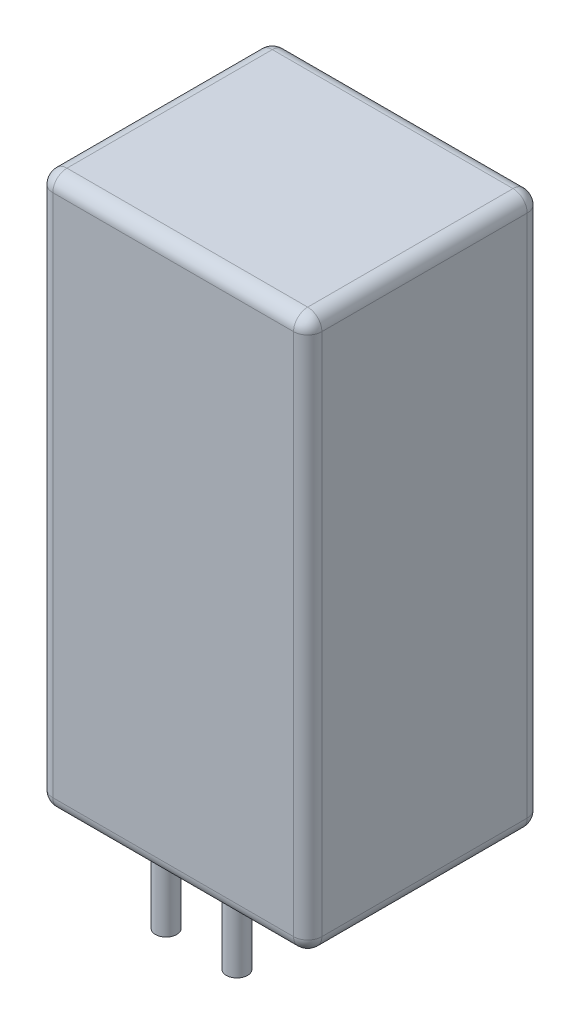
ISO-10303-21;
HEADER;
FILE_DESCRIPTION(('STEP AP214'),'2;1');
FILE_NAME('part.step','',(''),(''),'','','');
FILE_SCHEMA(('AUTOMOTIVE_DESIGN { 1 0 10303 214 1 1 1 1 }'));
ENDSEC;
DATA;
#1=APPLICATION_CONTEXT('core data for automotive mechanical design processes');
#2=APPLICATION_PROTOCOL_DEFINITION('international standard','automotive_design',2000,#1);
#3=PRODUCT_CONTEXT('',#1,'mechanical');
#4=PRODUCT('Part','Part','',(#3));
#5=PRODUCT_RELATED_PRODUCT_CATEGORY('part','',(#4));
#6=PRODUCT_DEFINITION_FORMATION('','',#4);
#7=PRODUCT_DEFINITION_CONTEXT('part definition',#1,'design');
#8=PRODUCT_DEFINITION('design','',#6,#7);
#9=PRODUCT_DEFINITION_SHAPE('','',#8);
#10=(LENGTH_UNIT() NAMED_UNIT(*) SI_UNIT(.MILLI.,.METRE.));
#11=(NAMED_UNIT(*) PLANE_ANGLE_UNIT() SI_UNIT($,.RADIAN.));
#12=(NAMED_UNIT(*) SI_UNIT($,.STERADIAN.) SOLID_ANGLE_UNIT());
#13=UNCERTAINTY_MEASURE_WITH_UNIT(LENGTH_MEASURE(1.E-05),#10,'distance_accuracy_value','');
#14=(GEOMETRIC_REPRESENTATION_CONTEXT(3) GLOBAL_UNCERTAINTY_ASSIGNED_CONTEXT((#13)) GLOBAL_UNIT_ASSIGNED_CONTEXT((#10,
#11,#12)) REPRESENTATION_CONTEXT('',''));
#15=CARTESIAN_POINT('',(0.,0.,0.));
#16=DIRECTION('',(0.,0.,1.));
#17=DIRECTION('',(1.,0.,0.));
#18=AXIS2_PLACEMENT_3D('',#15,#16,#17);
#19=CARTESIAN_POINT('',(5.,-10.,12.5));
#20=DIRECTION('',(0.,1.,0.));
#21=DIRECTION('',(0.,0.,1.));
#22=AXIS2_PLACEMENT_3D('',#19,#20,#21);
#23=CYLINDRICAL_SURFACE('',#22,1.5);
#24=CARTESIAN_POINT('',(5.,-10.,12.5));
#25=DIRECTION('',(0.,-1.,0.));
#26=DIRECTION('',(0.,0.,1.));
#27=AXIS2_PLACEMENT_3D('',#24,#25,#26);
#28=CIRCLE('',#27,1.5);
#29=CARTESIAN_POINT('',(5.,-10.,14.));
#30=VERTEX_POINT('',#29);
#31=EDGE_CURVE('E56',#30,#30,#28,.T.);
#32=ORIENTED_EDGE('',*,*,#31,.F.);
#33=EDGE_LOOP('',(#32));
#34=FACE_BOUND('',#33,.T.);
#35=CARTESIAN_POINT('',(5.,0.,12.5));
#36=DIRECTION('',(0.,-1.,0.));
#37=DIRECTION('',(0.,0.,1.));
#38=AXIS2_PLACEMENT_3D('',#35,#36,#37);
#39=CIRCLE('',#38,1.5);
#40=CARTESIAN_POINT('',(5.,0.,14.));
#41=VERTEX_POINT('',#40);
#42=EDGE_CURVE('E11',#41,#41,#39,.T.);
#43=ORIENTED_EDGE('',*,*,#42,.T.);
#44=EDGE_LOOP('',(#43));
#45=FACE_BOUND('',#44,.T.);
#46=ADVANCED_FACE('F52',(#34,#45),#23,.T.);
#47=CARTESIAN_POINT('',(5.,-10.,12.5));
#48=DIRECTION('',(0.,1.,0.));
#49=DIRECTION('',(0.,0.,1.));
#50=AXIS2_PLACEMENT_3D('',#47,#48,#49);
#51=PLANE('',#50);
#52=ORIENTED_EDGE('',*,*,#31,.T.);
#53=EDGE_LOOP('',(#52));
#54=FACE_BOUND('',#53,.T.);
#55=ADVANCED_FACE('F54',(#54),#51,.F.);
#56=CARTESIAN_POINT('',(5.,0.,12.5));
#57=DIRECTION('',(0.,1.,0.));
#58=DIRECTION('',(0.,0.,1.));
#59=AXIS2_PLACEMENT_3D('',#56,#57,#58);
#60=PLANE('',#59);
#61=ORIENTED_EDGE('',*,*,#42,.F.);
#62=EDGE_LOOP('',(#61));
#63=FACE_BOUND('',#62,.T.);
#64=ADVANCED_FACE('F71',(#63),#60,.T.);
#65=CLOSED_SHELL('',(#46,#55,#64));
#66=MANIFOLD_SOLID_BREP('B2',#65);
#67=CARTESIAN_POINT('',(-5.,-10.,12.5));
#68=DIRECTION('',(0.,1.,0.));
#69=DIRECTION('',(0.,0.,1.));
#70=AXIS2_PLACEMENT_3D('',#67,#68,#69);
#71=CYLINDRICAL_SURFACE('',#70,1.5);
#72=CARTESIAN_POINT('',(-5.,-10.,12.5));
#73=DIRECTION('',(0.,-1.,0.));
#74=DIRECTION('',(0.,0.,-1.));
#75=AXIS2_PLACEMENT_3D('',#72,#73,#74);
#76=CIRCLE('',#75,1.5);
#77=CARTESIAN_POINT('',(-5.,-10.,11.));
#78=VERTEX_POINT('',#77);
#79=EDGE_CURVE('E51',#78,#78,#76,.T.);
#80=ORIENTED_EDGE('',*,*,#79,.F.);
#81=EDGE_LOOP('',(#80));
#82=FACE_BOUND('',#81,.T.);
#83=CARTESIAN_POINT('',(-5.,0.,12.5));
#84=DIRECTION('',(0.,-1.,0.));
#85=DIRECTION('',(0.,0.,-1.));
#86=AXIS2_PLACEMENT_3D('',#83,#84,#85);
#87=CIRCLE('',#86,1.5);
#88=CARTESIAN_POINT('',(-5.,0.,11.));
#89=VERTEX_POINT('',#88);
#90=EDGE_CURVE('E105',#89,#89,#87,.T.);
#91=ORIENTED_EDGE('',*,*,#90,.T.);
#92=EDGE_LOOP('',(#91));
#93=FACE_BOUND('',#92,.T.);
#94=ADVANCED_FACE('F102',(#82,#93),#71,.T.);
#95=CARTESIAN_POINT('',(-5.,-10.,12.5));
#96=DIRECTION('',(0.,-1.,0.));
#97=DIRECTION('',(0.,0.,-1.));
#98=AXIS2_PLACEMENT_3D('',#95,#96,#97);
#99=PLANE('',#98);
#100=ORIENTED_EDGE('',*,*,#79,.T.);
#101=EDGE_LOOP('',(#100));
#102=FACE_BOUND('',#101,.T.);
#103=ADVANCED_FACE('F117',(#102),#99,.T.);
#104=CARTESIAN_POINT('',(-5.,0.,12.5));
#105=DIRECTION('',(0.,-1.,0.));
#106=DIRECTION('',(0.,0.,-1.));
#107=AXIS2_PLACEMENT_3D('',#104,#105,#106);
#108=PLANE('',#107);
#109=ORIENTED_EDGE('',*,*,#90,.F.);
#110=EDGE_LOOP('',(#109));
#111=FACE_BOUND('',#110,.T.);
#112=ADVANCED_FACE('F115',(#111),#108,.F.);
#113=CLOSED_SHELL('',(#94,#103,#112));
#114=MANIFOLD_SOLID_BREP('B6',#113);
#115=CARTESIAN_POINT('',(-19.,78.,-16.5));
#116=DIRECTION('',(1.,0.,0.));
#117=DIRECTION('',(0.,0.,-1.));
#118=AXIS2_PLACEMENT_3D('',#115,#116,#117);
#119=PLANE('',#118);
#120=DIRECTION('',(0.,-1.,0.));
#121=VECTOR('',#120,1.);
#122=CARTESIAN_POINT('',(-19.,78.,14.5));
#123=LINE('',#122,#121);
#124=CARTESIAN_POINT('',(-19.,2.,14.5));
#125=VERTEX_POINT('',#124);
#126=CARTESIAN_POINT('',(-19.,76.,14.5));
#127=VERTEX_POINT('',#126);
#128=EDGE_CURVE('E238',#125,#127,#123,.F.);
#129=ORIENTED_EDGE('',*,*,#128,.T.);
#130=DIRECTION('',(0.,0.,1.));
#131=VECTOR('',#130,1.);
#132=CARTESIAN_POINT('',(-19.,76.,-16.5));
#133=LINE('',#132,#131);
#134=CARTESIAN_POINT('',(-19.,76.,-14.5));
#135=VERTEX_POINT('',#134);
#136=EDGE_CURVE('E275',#127,#135,#133,.F.);
#137=ORIENTED_EDGE('',*,*,#136,.T.);
#138=DIRECTION('',(0.,-1.,0.));
#139=VECTOR('',#138,1.);
#140=CARTESIAN_POINT('',(-19.,78.,-14.5));
#141=LINE('',#140,#139);
#142=CARTESIAN_POINT('',(-19.,2.,-14.5));
#143=VERTEX_POINT('',#142);
#144=EDGE_CURVE('E272',#135,#143,#141,.T.);
#145=ORIENTED_EDGE('',*,*,#144,.T.);
#146=DIRECTION('',(0.,0.,1.));
#147=VECTOR('',#146,1.);
#148=CARTESIAN_POINT('',(-19.,2.,16.5));
#149=LINE('',#148,#147);
#150=EDGE_CURVE('E267',#143,#125,#149,.T.);
#151=ORIENTED_EDGE('',*,*,#150,.T.);
#152=EDGE_LOOP('',(#129,#137,#145,#151));
#153=FACE_BOUND('',#152,.T.);
#154=ADVANCED_FACE('F143',(#153),#119,.F.);
#155=CARTESIAN_POINT('',(19.,78.,16.5));
#156=DIRECTION('',(0.,0.,-1.));
#157=DIRECTION('',(-1.,0.,0.));
#158=AXIS2_PLACEMENT_3D('',#155,#156,#157);
#159=PLANE('',#158);
#160=DIRECTION('',(0.,-1.,0.));
#161=VECTOR('',#160,1.);
#162=CARTESIAN_POINT('',(17.,78.,16.5));
#163=LINE('',#162,#161);
#164=CARTESIAN_POINT('',(17.,2.,16.5));
#165=VERTEX_POINT('',#164);
#166=CARTESIAN_POINT('',(17.,76.,16.5));
#167=VERTEX_POINT('',#166);
#168=EDGE_CURVE('E260',#165,#167,#163,.F.);
#169=ORIENTED_EDGE('',*,*,#168,.T.);
#170=DIRECTION('',(1.,0.,0.));
#171=VECTOR('',#170,1.);
#172=CARTESIAN_POINT('',(19.,76.,16.5));
#173=LINE('',#172,#171);
#174=CARTESIAN_POINT('',(-17.,76.,16.5));
#175=VERTEX_POINT('',#174);
#176=EDGE_CURVE('E264',#167,#175,#173,.F.);
#177=ORIENTED_EDGE('',*,*,#176,.T.);
#178=DIRECTION('',(0.,-1.,0.));
#179=VECTOR('',#178,1.);
#180=CARTESIAN_POINT('',(-17.,78.,16.5));
#181=LINE('',#180,#179);
#182=CARTESIAN_POINT('',(-17.,2.,16.5));
#183=VERTEX_POINT('',#182);
#184=EDGE_CURVE('E236',#175,#183,#181,.T.);
#185=ORIENTED_EDGE('',*,*,#184,.T.);
#186=DIRECTION('',(1.,0.,0.));
#187=VECTOR('',#186,1.);
#188=CARTESIAN_POINT('',(19.,2.,16.5));
#189=LINE('',#188,#187);
#190=EDGE_CURVE('E254',#183,#165,#189,.T.);
#191=ORIENTED_EDGE('',*,*,#190,.T.);
#192=EDGE_LOOP('',(#169,#177,#185,#191));
#193=FACE_BOUND('',#192,.T.);
#194=ADVANCED_FACE('F262',(#193),#159,.F.);
#195=CARTESIAN_POINT('',(19.,78.,-16.5));
#196=DIRECTION('',(-1.,0.,0.));
#197=DIRECTION('',(0.,0.,1.));
#198=AXIS2_PLACEMENT_3D('',#195,#196,#197);
#199=PLANE('',#198);
#200=DIRECTION('',(0.,-1.,0.));
#201=VECTOR('',#200,1.);
#202=CARTESIAN_POINT('',(19.,78.,-14.5));
#203=LINE('',#202,#201);
#204=CARTESIAN_POINT('',(19.,2.,-14.5));
#205=VERTEX_POINT('',#204);
#206=CARTESIAN_POINT('',(19.,76.,-14.5));
#207=VERTEX_POINT('',#206);
#208=EDGE_CURVE('E279',#205,#207,#203,.F.);
#209=ORIENTED_EDGE('',*,*,#208,.T.);
#210=DIRECTION('',(0.,0.,-1.));
#211=VECTOR('',#210,1.);
#212=CARTESIAN_POINT('',(19.,76.,-16.5));
#213=LINE('',#212,#211);
#214=CARTESIAN_POINT('',(19.,76.,14.5));
#215=VERTEX_POINT('',#214);
#216=EDGE_CURVE('E284',#207,#215,#213,.F.);
#217=ORIENTED_EDGE('',*,*,#216,.T.);
#218=DIRECTION('',(0.,-1.,0.));
#219=VECTOR('',#218,1.);
#220=CARTESIAN_POINT('',(19.,78.,14.5));
#221=LINE('',#220,#219);
#222=CARTESIAN_POINT('',(19.,2.,14.5));
#223=VERTEX_POINT('',#222);
#224=EDGE_CURVE('E281',#215,#223,#221,.T.);
#225=ORIENTED_EDGE('',*,*,#224,.T.);
#226=DIRECTION('',(0.,0.,-1.));
#227=VECTOR('',#226,1.);
#228=CARTESIAN_POINT('',(19.,2.,-16.5));
#229=LINE('',#228,#227);
#230=EDGE_CURVE('E277',#223,#205,#229,.T.);
#231=ORIENTED_EDGE('',*,*,#230,.T.);
#232=EDGE_LOOP('',(#209,#217,#225,#231));
#233=FACE_BOUND('',#232,.T.);
#234=ADVANCED_FACE('F389',(#233),#199,.F.);
#235=CARTESIAN_POINT('',(19.,78.,-16.5));
#236=DIRECTION('',(0.,0.,1.));
#237=DIRECTION('',(1.,0.,0.));
#238=AXIS2_PLACEMENT_3D('',#235,#236,#237);
#239=PLANE('',#238);
#240=DIRECTION('',(0.,-1.,0.));
#241=VECTOR('',#240,1.);
#242=CARTESIAN_POINT('',(-17.,78.,-16.5));
#243=LINE('',#242,#241);
#244=CARTESIAN_POINT('',(-17.,2.,-16.5));
#245=VERTEX_POINT('',#244);
#246=CARTESIAN_POINT('',(-17.,76.,-16.5));
#247=VERTEX_POINT('',#246);
#248=EDGE_CURVE('E288',#245,#247,#243,.F.);
#249=ORIENTED_EDGE('',*,*,#248,.T.);
#250=DIRECTION('',(-1.,0.,0.));
#251=VECTOR('',#250,1.);
#252=CARTESIAN_POINT('',(19.,76.,-16.5));
#253=LINE('',#252,#251);
#254=CARTESIAN_POINT('',(17.,76.,-16.5));
#255=VERTEX_POINT('',#254);
#256=EDGE_CURVE('E293',#247,#255,#253,.F.);
#257=ORIENTED_EDGE('',*,*,#256,.T.);
#258=DIRECTION('',(0.,-1.,0.));
#259=VECTOR('',#258,1.);
#260=CARTESIAN_POINT('',(17.,78.,-16.5));
#261=LINE('',#260,#259);
#262=CARTESIAN_POINT('',(17.,2.,-16.5));
#263=VERTEX_POINT('',#262);
#264=EDGE_CURVE('E290',#255,#263,#261,.T.);
#265=ORIENTED_EDGE('',*,*,#264,.T.);
#266=DIRECTION('',(-1.,0.,0.));
#267=VECTOR('',#266,1.);
#268=CARTESIAN_POINT('',(-19.,2.,-16.5));
#269=LINE('',#268,#267);
#270=EDGE_CURVE('E286',#263,#245,#269,.T.);
#271=ORIENTED_EDGE('',*,*,#270,.T.);
#272=EDGE_LOOP('',(#249,#257,#265,#271));
#273=FACE_BOUND('',#272,.T.);
#274=ADVANCED_FACE('F399',(#273),#239,.F.);
#275=CARTESIAN_POINT('',(0.,78.,0.));
#276=DIRECTION('',(0.,-1.,0.));
#277=DIRECTION('',(0.,0.,-1.));
#278=AXIS2_PLACEMENT_3D('',#275,#276,#277);
#279=PLANE('',#278);
#280=DIRECTION('',(0.,0.,-1.));
#281=VECTOR('',#280,1.);
#282=CARTESIAN_POINT('',(17.,78.,0.));
#283=LINE('',#282,#281);
#284=CARTESIAN_POINT('',(17.,78.,14.5));
#285=VERTEX_POINT('',#284);
#286=CARTESIAN_POINT('',(17.,78.,-14.5));
#287=VERTEX_POINT('',#286);
#288=EDGE_CURVE('E299',#285,#287,#283,.T.);
#289=ORIENTED_EDGE('',*,*,#288,.T.);
#290=DIRECTION('',(-1.,0.,0.));
#291=VECTOR('',#290,1.);
#292=CARTESIAN_POINT('',(0.,78.,-14.5));
#293=LINE('',#292,#291);
#294=CARTESIAN_POINT('',(-17.,78.,-14.5));
#295=VERTEX_POINT('',#294);
#296=EDGE_CURVE('E301',#287,#295,#293,.T.);
#297=ORIENTED_EDGE('',*,*,#296,.T.);
#298=DIRECTION('',(0.,0.,1.));
#299=VECTOR('',#298,1.);
#300=CARTESIAN_POINT('',(-17.,78.,0.));
#301=LINE('',#300,#299);
#302=CARTESIAN_POINT('',(-17.,78.,14.5));
#303=VERTEX_POINT('',#302);
#304=EDGE_CURVE('E295',#295,#303,#301,.T.);
#305=ORIENTED_EDGE('',*,*,#304,.T.);
#306=DIRECTION('',(1.,0.,0.));
#307=VECTOR('',#306,1.);
#308=CARTESIAN_POINT('',(0.,78.,14.5));
#309=LINE('',#308,#307);
#310=EDGE_CURVE('E297',#303,#285,#309,.T.);
#311=ORIENTED_EDGE('',*,*,#310,.T.);
#312=EDGE_LOOP('',(#289,#297,#305,#311));
#313=FACE_BOUND('',#312,.T.);
#314=ADVANCED_FACE('F381',(#313),#279,.F.);
#315=CARTESIAN_POINT('',(0.,0.,0.));
#316=DIRECTION('',(0.,-1.,0.));
#317=DIRECTION('',(0.,0.,-1.));
#318=AXIS2_PLACEMENT_3D('',#315,#316,#317);
#319=PLANE('',#318);
#320=DIRECTION('',(0.,0.,1.));
#321=VECTOR('',#320,1.);
#322=CARTESIAN_POINT('',(-17.,0.,-16.5));
#323=LINE('',#322,#321);
#324=CARTESIAN_POINT('',(-17.,0.,14.5));
#325=VERTEX_POINT('',#324);
#326=CARTESIAN_POINT('',(-17.,0.,-14.5));
#327=VERTEX_POINT('',#326);
#328=EDGE_CURVE('E304',#325,#327,#323,.F.);
#329=ORIENTED_EDGE('',*,*,#328,.T.);
#330=DIRECTION('',(-1.,0.,0.));
#331=VECTOR('',#330,1.);
#332=CARTESIAN_POINT('',(19.,0.,-14.5));
#333=LINE('',#332,#331);
#334=CARTESIAN_POINT('',(17.,0.,-14.5));
#335=VERTEX_POINT('',#334);
#336=EDGE_CURVE('E100',#327,#335,#333,.F.);
#337=ORIENTED_EDGE('',*,*,#336,.T.);
#338=DIRECTION('',(0.,0.,-1.));
#339=VECTOR('',#338,1.);
#340=CARTESIAN_POINT('',(17.,0.,16.5));
#341=LINE('',#340,#339);
#342=CARTESIAN_POINT('',(17.,0.,14.5));
#343=VERTEX_POINT('',#342);
#344=EDGE_CURVE('E152',#335,#343,#341,.F.);
#345=ORIENTED_EDGE('',*,*,#344,.T.);
#346=DIRECTION('',(1.,0.,0.));
#347=VECTOR('',#346,1.);
#348=CARTESIAN_POINT('',(-19.,0.,14.5));
#349=LINE('',#348,#347);
#350=EDGE_CURVE('E306',#343,#325,#349,.F.);
#351=ORIENTED_EDGE('',*,*,#350,.T.);
#352=EDGE_LOOP('',(#329,#337,#345,#351));
#353=FACE_BOUND('',#352,.T.);
#354=ADVANCED_FACE('F587',(#353),#319,.T.);
#355=CARTESIAN_POINT('',(17.,78.,-14.5));
#356=DIRECTION('',(0.,-1.,0.));
#357=DIRECTION('',(0.,0.,-1.));
#358=AXIS2_PLACEMENT_3D('',#355,#356,#357);
#359=CYLINDRICAL_SURFACE('',#358,2.);
#360=CARTESIAN_POINT('',(17.,76.,-14.5));
#361=DIRECTION('',(0.,1.,0.));
#362=DIRECTION('',(0.,0.,1.));
#363=AXIS2_PLACEMENT_3D('',#360,#361,#362);
#364=CIRCLE('',#363,2.);
#365=EDGE_CURVE('E147',#207,#255,#364,.T.);
#366=ORIENTED_EDGE('',*,*,#365,.F.);
#367=ORIENTED_EDGE('',*,*,#208,.F.);
#368=CARTESIAN_POINT('',(17.,2.,-14.5));
#369=DIRECTION('',(0.,-1.,0.));
#370=DIRECTION('',(0.,0.,-1.));
#371=AXIS2_PLACEMENT_3D('',#368,#369,#370);
#372=CIRCLE('',#371,2.);
#373=EDGE_CURVE('E359',#263,#205,#372,.T.);
#374=ORIENTED_EDGE('',*,*,#373,.F.);
#375=ORIENTED_EDGE('',*,*,#264,.F.);
#376=EDGE_LOOP('',(#366,#367,#374,#375));
#377=FACE_BOUND('',#376,.T.);
#378=ADVANCED_FACE('F145',(#377),#359,.T.);
#379=CARTESIAN_POINT('',(17.,76.,-14.5));
#380=DIRECTION('',(0.,0.,-1.));
#381=DIRECTION('',(-1.,0.,0.));
#382=AXIS2_PLACEMENT_3D('',#379,#380,#381);
#383=SPHERICAL_SURFACE('',#382,2.);
#384=CARTESIAN_POINT('',(17.,76.,-14.5));
#385=DIRECTION('',(0.,0.,-1.));
#386=DIRECTION('',(-1.,0.,0.));
#387=AXIS2_PLACEMENT_3D('',#384,#385,#386);
#388=CIRCLE('',#387,2.);
#389=EDGE_CURVE('E354',#207,#287,#388,.F.);
#390=ORIENTED_EDGE('',*,*,#389,.F.);
#391=ORIENTED_EDGE('',*,*,#365,.T.);
#392=CARTESIAN_POINT('',(17.,76.,-14.5));
#393=DIRECTION('',(1.,0.,0.));
#394=DIRECTION('',(0.,0.,-1.));
#395=AXIS2_PLACEMENT_3D('',#392,#393,#394);
#396=CIRCLE('',#395,2.);
#397=EDGE_CURVE('E357',#287,#255,#396,.F.);
#398=ORIENTED_EDGE('',*,*,#397,.F.);
#399=EDGE_LOOP('',(#390,#391,#398));
#400=FACE_BOUND('',#399,.T.);
#401=ADVANCED_FACE('F369',(#400),#383,.T.);
#402=CARTESIAN_POINT('',(17.,2.,-14.5));
#403=DIRECTION('',(1.,0.,0.));
#404=DIRECTION('',(0.,1.,0.));
#405=AXIS2_PLACEMENT_3D('',#402,#403,#404);
#406=SPHERICAL_SURFACE('',#405,2.);
#407=CARTESIAN_POINT('',(17.,2.,-14.5));
#408=DIRECTION('',(1.,0.,0.));
#409=DIRECTION('',(0.,0.,-1.));
#410=AXIS2_PLACEMENT_3D('',#407,#408,#409);
#411=CIRCLE('',#410,2.);
#412=EDGE_CURVE('E349',#263,#335,#411,.F.);
#413=ORIENTED_EDGE('',*,*,#412,.F.);
#414=ORIENTED_EDGE('',*,*,#373,.T.);
#415=CARTESIAN_POINT('',(17.,2.,-14.5));
#416=DIRECTION('',(0.,0.,-1.));
#417=DIRECTION('',(-1.,0.,0.));
#418=AXIS2_PLACEMENT_3D('',#415,#416,#417);
#419=CIRCLE('',#418,2.);
#420=EDGE_CURVE('E352',#335,#205,#419,.F.);
#421=ORIENTED_EDGE('',*,*,#420,.F.);
#422=EDGE_LOOP('',(#413,#414,#421));
#423=FACE_BOUND('',#422,.T.);
#424=ADVANCED_FACE('F566',(#423),#406,.T.);
#425=CARTESIAN_POINT('',(0.,76.,-14.5));
#426=DIRECTION('',(-1.,0.,0.));
#427=DIRECTION('',(0.,0.,1.));
#428=AXIS2_PLACEMENT_3D('',#425,#426,#427);
#429=CYLINDRICAL_SURFACE('',#428,2.);
#430=ORIENTED_EDGE('',*,*,#397,.T.);
#431=ORIENTED_EDGE('',*,*,#256,.F.);
#432=CARTESIAN_POINT('',(-17.,76.,-14.5));
#433=DIRECTION('',(-1.,0.,0.));
#434=DIRECTION('',(0.,0.,1.));
#435=AXIS2_PLACEMENT_3D('',#432,#433,#434);
#436=CIRCLE('',#435,2.);
#437=EDGE_CURVE('E343',#295,#247,#436,.T.);
#438=ORIENTED_EDGE('',*,*,#437,.F.);
#439=ORIENTED_EDGE('',*,*,#296,.F.);
#440=EDGE_LOOP('',(#430,#431,#438,#439));
#441=FACE_BOUND('',#440,.T.);
#442=ADVANCED_FACE('F377',(#441),#429,.T.);
#443=CARTESIAN_POINT('',(17.,76.,0.));
#444=DIRECTION('',(0.,0.,-1.));
#445=DIRECTION('',(-1.,0.,0.));
#446=AXIS2_PLACEMENT_3D('',#443,#444,#445);
#447=CYLINDRICAL_SURFACE('',#446,2.);
#448=ORIENTED_EDGE('',*,*,#389,.T.);
#449=ORIENTED_EDGE('',*,*,#288,.F.);
#450=CARTESIAN_POINT('',(17.,76.,14.5));
#451=DIRECTION('',(0.,0.,1.));
#452=DIRECTION('',(0.,-1.,0.));
#453=AXIS2_PLACEMENT_3D('',#450,#451,#452);
#454=CIRCLE('',#453,2.);
#455=EDGE_CURVE('E340',#215,#285,#454,.T.);
#456=ORIENTED_EDGE('',*,*,#455,.F.);
#457=ORIENTED_EDGE('',*,*,#216,.F.);
#458=EDGE_LOOP('',(#448,#449,#456,#457));
#459=FACE_BOUND('',#458,.T.);
#460=ADVANCED_FACE('F386',(#459),#447,.T.);
#461=CARTESIAN_POINT('',(17.,78.,14.5));
#462=DIRECTION('',(0.,-1.,0.));
#463=DIRECTION('',(0.,0.,-1.));
#464=AXIS2_PLACEMENT_3D('',#461,#462,#463);
#465=CYLINDRICAL_SURFACE('',#464,2.);
#466=CARTESIAN_POINT('',(17.,2.,14.5));
#467=DIRECTION('',(0.,-1.,0.));
#468=DIRECTION('',(0.,0.,-1.));
#469=AXIS2_PLACEMENT_3D('',#466,#467,#468);
#470=CIRCLE('',#469,2.);
#471=EDGE_CURVE('E334',#223,#165,#470,.T.);
#472=ORIENTED_EDGE('',*,*,#471,.F.);
#473=ORIENTED_EDGE('',*,*,#224,.F.);
#474=CARTESIAN_POINT('',(17.,76.,14.5));
#475=DIRECTION('',(0.,1.,0.));
#476=DIRECTION('',(0.,0.,1.));
#477=AXIS2_PLACEMENT_3D('',#474,#475,#476);
#478=CIRCLE('',#477,2.);
#479=EDGE_CURVE('E337',#167,#215,#478,.T.);
#480=ORIENTED_EDGE('',*,*,#479,.F.);
#481=ORIENTED_EDGE('',*,*,#168,.F.);
#482=EDGE_LOOP('',(#472,#473,#480,#481));
#483=FACE_BOUND('',#482,.T.);
#484=ADVANCED_FACE('F393',(#483),#465,.T.);
#485=CARTESIAN_POINT('',(17.,2.,-16.5));
#486=DIRECTION('',(0.,0.,1.));
#487=DIRECTION('',(1.,0.,0.));
#488=AXIS2_PLACEMENT_3D('',#485,#486,#487);
#489=CYLINDRICAL_SURFACE('',#488,2.);
#490=ORIENTED_EDGE('',*,*,#420,.T.);
#491=ORIENTED_EDGE('',*,*,#230,.F.);
#492=CARTESIAN_POINT('',(17.,2.,14.5));
#493=DIRECTION('',(0.,0.,1.));
#494=DIRECTION('',(1.,0.,0.));
#495=AXIS2_PLACEMENT_3D('',#492,#493,#494);
#496=CIRCLE('',#495,2.);
#497=EDGE_CURVE('E332',#343,#223,#496,.T.);
#498=ORIENTED_EDGE('',*,*,#497,.F.);
#499=ORIENTED_EDGE('',*,*,#344,.F.);
#500=EDGE_LOOP('',(#490,#491,#498,#499));
#501=FACE_BOUND('',#500,.T.);
#502=ADVANCED_FACE('F397',(#501),#489,.T.);
#503=CARTESIAN_POINT('',(19.,2.,-14.5));
#504=DIRECTION('',(1.,0.,0.));
#505=DIRECTION('',(0.,0.,-1.));
#506=AXIS2_PLACEMENT_3D('',#503,#504,#505);
#507=CYLINDRICAL_SURFACE('',#506,2.);
#508=ORIENTED_EDGE('',*,*,#412,.T.);
#509=ORIENTED_EDGE('',*,*,#336,.F.);
#510=CARTESIAN_POINT('',(-17.,2.,-14.5));
#511=DIRECTION('',(-1.,0.,0.));
#512=DIRECTION('',(0.,0.,1.));
#513=AXIS2_PLACEMENT_3D('',#510,#511,#512);
#514=CIRCLE('',#513,2.);
#515=EDGE_CURVE('E329',#245,#327,#514,.T.);
#516=ORIENTED_EDGE('',*,*,#515,.F.);
#517=ORIENTED_EDGE('',*,*,#270,.F.);
#518=EDGE_LOOP('',(#508,#509,#516,#517));
#519=FACE_BOUND('',#518,.T.);
#520=ADVANCED_FACE('F409',(#519),#507,.T.);
#521=CARTESIAN_POINT('',(-17.,78.,-14.5));
#522=DIRECTION('',(0.,-1.,0.));
#523=DIRECTION('',(0.,0.,-1.));
#524=AXIS2_PLACEMENT_3D('',#521,#522,#523);
#525=CYLINDRICAL_SURFACE('',#524,2.);
#526=CARTESIAN_POINT('',(-17.,76.,-14.5));
#527=DIRECTION('',(0.,1.,0.));
#528=DIRECTION('',(0.,0.,1.));
#529=AXIS2_PLACEMENT_3D('',#526,#527,#528);
#530=CIRCLE('',#529,2.);
#531=EDGE_CURVE('E346',#247,#135,#530,.T.);
#532=ORIENTED_EDGE('',*,*,#531,.F.);
#533=ORIENTED_EDGE('',*,*,#248,.F.);
#534=CARTESIAN_POINT('',(-17.,2.,-14.5));
#535=DIRECTION('',(0.,-1.,0.));
#536=DIRECTION('',(0.,0.,-1.));
#537=AXIS2_PLACEMENT_3D('',#534,#535,#536);
#538=CIRCLE('',#537,2.);
#539=EDGE_CURVE('E326',#143,#245,#538,.T.);
#540=ORIENTED_EDGE('',*,*,#539,.F.);
#541=ORIENTED_EDGE('',*,*,#144,.F.);
#542=EDGE_LOOP('',(#532,#533,#540,#541));
#543=FACE_BOUND('',#542,.T.);
#544=ADVANCED_FACE('F404',(#543),#525,.T.);
#545=CARTESIAN_POINT('',(-17.,76.,-14.5));
#546=DIRECTION('',(0.,0.,-1.));
#547=DIRECTION('',(-1.,0.,0.));
#548=AXIS2_PLACEMENT_3D('',#545,#546,#547);
#549=SPHERICAL_SURFACE('',#548,2.);
#550=ORIENTED_EDGE('',*,*,#437,.T.);
#551=ORIENTED_EDGE('',*,*,#531,.T.);
#552=CARTESIAN_POINT('',(-17.,76.,-14.5));
#553=DIRECTION('',(0.,0.,-1.));
#554=DIRECTION('',(-1.,0.,0.));
#555=AXIS2_PLACEMENT_3D('',#552,#553,#554);
#556=CIRCLE('',#555,2.);
#557=EDGE_CURVE('E323',#295,#135,#556,.F.);
#558=ORIENTED_EDGE('',*,*,#557,.F.);
#559=EDGE_LOOP('',(#550,#551,#558));
#560=FACE_BOUND('',#559,.T.);
#561=ADVANCED_FACE('F420',(#560),#549,.T.);
#562=CARTESIAN_POINT('',(17.,76.,14.5));
#563=DIRECTION('',(1.,0.,0.));
#564=DIRECTION('',(0.,0.,-1.));
#565=AXIS2_PLACEMENT_3D('',#562,#563,#564);
#566=SPHERICAL_SURFACE('',#565,2.);
#567=ORIENTED_EDGE('',*,*,#479,.T.);
#568=ORIENTED_EDGE('',*,*,#455,.T.);
#569=CARTESIAN_POINT('',(17.,76.,14.5));
#570=DIRECTION('',(1.,0.,0.));
#571=DIRECTION('',(0.,0.,-1.));
#572=AXIS2_PLACEMENT_3D('',#569,#570,#571);
#573=CIRCLE('',#572,2.);
#574=EDGE_CURVE('E320',#167,#285,#573,.F.);
#575=ORIENTED_EDGE('',*,*,#574,.F.);
#576=EDGE_LOOP('',(#567,#568,#575));
#577=FACE_BOUND('',#576,.T.);
#578=ADVANCED_FACE('F430',(#577),#566,.T.);
#579=CARTESIAN_POINT('',(17.,2.,14.5));
#580=DIRECTION('',(1.,0.,0.));
#581=DIRECTION('',(0.,0.,-1.));
#582=AXIS2_PLACEMENT_3D('',#579,#580,#581);
#583=SPHERICAL_SURFACE('',#582,2.);
#584=ORIENTED_EDGE('',*,*,#497,.T.);
#585=ORIENTED_EDGE('',*,*,#471,.T.);
#586=CARTESIAN_POINT('',(17.,2.,14.5));
#587=DIRECTION('',(1.,0.,0.));
#588=DIRECTION('',(0.,0.,-1.));
#589=AXIS2_PLACEMENT_3D('',#586,#587,#588);
#590=CIRCLE('',#589,2.);
#591=EDGE_CURVE('E257',#343,#165,#590,.F.);
#592=ORIENTED_EDGE('',*,*,#591,.F.);
#593=EDGE_LOOP('',(#584,#585,#592));
#594=FACE_BOUND('',#593,.T.);
#595=ADVANCED_FACE('F432',(#594),#583,.T.);
#596=CARTESIAN_POINT('',(-17.,2.,-14.5));
#597=DIRECTION('',(0.,0.,-1.));
#598=DIRECTION('',(0.,1.,0.));
#599=AXIS2_PLACEMENT_3D('',#596,#597,#598);
#600=SPHERICAL_SURFACE('',#599,2.);
#601=ORIENTED_EDGE('',*,*,#539,.T.);
#602=ORIENTED_EDGE('',*,*,#515,.T.);
#603=CARTESIAN_POINT('',(-17.,2.,-14.5));
#604=DIRECTION('',(0.,0.,-1.));
#605=DIRECTION('',(-1.,0.,0.));
#606=AXIS2_PLACEMENT_3D('',#603,#604,#605);
#607=CIRCLE('',#606,2.);
#608=EDGE_CURVE('E316',#143,#327,#607,.F.);
#609=ORIENTED_EDGE('',*,*,#608,.F.);
#610=EDGE_LOOP('',(#601,#602,#609));
#611=FACE_BOUND('',#610,.T.);
#612=ADVANCED_FACE('F411',(#611),#600,.T.);
#613=CARTESIAN_POINT('',(-17.,76.,0.));
#614=DIRECTION('',(0.,0.,1.));
#615=DIRECTION('',(1.,0.,0.));
#616=AXIS2_PLACEMENT_3D('',#613,#614,#615);
#617=CYLINDRICAL_SURFACE('',#616,2.);
#618=ORIENTED_EDGE('',*,*,#557,.T.);
#619=ORIENTED_EDGE('',*,*,#136,.F.);
#620=CARTESIAN_POINT('',(-17.,76.,14.5));
#621=DIRECTION('',(0.,0.,1.));
#622=DIRECTION('',(1.,0.,0.));
#623=AXIS2_PLACEMENT_3D('',#620,#621,#622);
#624=CIRCLE('',#623,2.);
#625=EDGE_CURVE('E313',#303,#127,#624,.T.);
#626=ORIENTED_EDGE('',*,*,#625,.F.);
#627=ORIENTED_EDGE('',*,*,#304,.F.);
#628=EDGE_LOOP('',(#618,#619,#626,#627));
#629=FACE_BOUND('',#628,.T.);
#630=ADVANCED_FACE('F422',(#629),#617,.T.);
#631=CARTESIAN_POINT('',(0.,76.,14.5));
#632=DIRECTION('',(1.,0.,0.));
#633=DIRECTION('',(0.,0.,-1.));
#634=AXIS2_PLACEMENT_3D('',#631,#632,#633);
#635=CYLINDRICAL_SURFACE('',#634,2.);
#636=ORIENTED_EDGE('',*,*,#574,.T.);
#637=ORIENTED_EDGE('',*,*,#310,.F.);
#638=CARTESIAN_POINT('',(-17.,76.,14.5));
#639=DIRECTION('',(-1.,0.,0.));
#640=DIRECTION('',(0.,-1.,0.));
#641=AXIS2_PLACEMENT_3D('',#638,#639,#640);
#642=CIRCLE('',#641,2.);
#643=EDGE_CURVE('E251',#175,#303,#642,.T.);
#644=ORIENTED_EDGE('',*,*,#643,.F.);
#645=ORIENTED_EDGE('',*,*,#176,.F.);
#646=EDGE_LOOP('',(#636,#637,#644,#645));
#647=FACE_BOUND('',#646,.T.);
#648=ADVANCED_FACE('F428',(#647),#635,.T.);
#649=CARTESIAN_POINT('',(19.,2.,14.5));
#650=DIRECTION('',(-1.,0.,0.));
#651=DIRECTION('',(0.,0.,1.));
#652=AXIS2_PLACEMENT_3D('',#649,#650,#651);
#653=CYLINDRICAL_SURFACE('',#652,2.);
#654=ORIENTED_EDGE('',*,*,#591,.T.);
#655=ORIENTED_EDGE('',*,*,#190,.F.);
#656=CARTESIAN_POINT('',(-17.,2.,14.5));
#657=DIRECTION('',(-1.,0.,0.));
#658=DIRECTION('',(0.,0.,1.));
#659=AXIS2_PLACEMENT_3D('',#656,#657,#658);
#660=CIRCLE('',#659,2.);
#661=EDGE_CURVE('E244',#325,#183,#660,.T.);
#662=ORIENTED_EDGE('',*,*,#661,.F.);
#663=ORIENTED_EDGE('',*,*,#350,.F.);
#664=EDGE_LOOP('',(#654,#655,#662,#663));
#665=FACE_BOUND('',#664,.T.);
#666=ADVANCED_FACE('F255',(#665),#653,.T.);
#667=CARTESIAN_POINT('',(-17.,2.,-16.5));
#668=DIRECTION('',(0.,0.,-1.));
#669=DIRECTION('',(-1.,0.,0.));
#670=AXIS2_PLACEMENT_3D('',#667,#668,#669);
#671=CYLINDRICAL_SURFACE('',#670,2.);
#672=ORIENTED_EDGE('',*,*,#608,.T.);
#673=ORIENTED_EDGE('',*,*,#328,.F.);
#674=CARTESIAN_POINT('',(-17.,2.,14.5));
#675=DIRECTION('',(0.,0.,1.));
#676=DIRECTION('',(1.,0.,0.));
#677=AXIS2_PLACEMENT_3D('',#674,#675,#676);
#678=CIRCLE('',#677,2.);
#679=EDGE_CURVE('E248',#125,#325,#678,.T.);
#680=ORIENTED_EDGE('',*,*,#679,.F.);
#681=ORIENTED_EDGE('',*,*,#150,.F.);
#682=EDGE_LOOP('',(#672,#673,#680,#681));
#683=FACE_BOUND('',#682,.T.);
#684=ADVANCED_FACE('F415',(#683),#671,.T.);
#685=CARTESIAN_POINT('',(-17.,76.,14.5));
#686=DIRECTION('',(0.,1.,0.));
#687=DIRECTION('',(0.,0.,1.));
#688=AXIS2_PLACEMENT_3D('',#685,#686,#687);
#689=SPHERICAL_SURFACE('',#688,2.);
#690=ORIENTED_EDGE('',*,*,#643,.T.);
#691=ORIENTED_EDGE('',*,*,#625,.T.);
#692=CARTESIAN_POINT('',(-17.,76.,14.5));
#693=DIRECTION('',(0.,1.,0.));
#694=DIRECTION('',(0.,0.,1.));
#695=AXIS2_PLACEMENT_3D('',#692,#693,#694);
#696=CIRCLE('',#695,2.);
#697=EDGE_CURVE('E241',#175,#127,#696,.F.);
#698=ORIENTED_EDGE('',*,*,#697,.F.);
#699=EDGE_LOOP('',(#690,#691,#698));
#700=FACE_BOUND('',#699,.T.);
#701=ADVANCED_FACE('F426',(#700),#689,.T.);
#702=CARTESIAN_POINT('',(-17.,2.,14.5));
#703=DIRECTION('',(0.,-1.,0.));
#704=DIRECTION('',(0.,0.,-1.));
#705=AXIS2_PLACEMENT_3D('',#702,#703,#704);
#706=SPHERICAL_SURFACE('',#705,2.);
#707=ORIENTED_EDGE('',*,*,#679,.T.);
#708=ORIENTED_EDGE('',*,*,#661,.T.);
#709=CARTESIAN_POINT('',(-17.,2.,14.5));
#710=DIRECTION('',(0.,-1.,0.));
#711=DIRECTION('',(0.,0.,-1.));
#712=AXIS2_PLACEMENT_3D('',#709,#710,#711);
#713=CIRCLE('',#712,2.);
#714=EDGE_CURVE('E232',#125,#183,#713,.F.);
#715=ORIENTED_EDGE('',*,*,#714,.F.);
#716=EDGE_LOOP('',(#707,#708,#715));
#717=FACE_BOUND('',#716,.T.);
#718=ADVANCED_FACE('F246',(#717),#706,.T.);
#719=CARTESIAN_POINT('',(-17.,78.,14.5));
#720=DIRECTION('',(0.,-1.,0.));
#721=DIRECTION('',(0.,0.,-1.));
#722=AXIS2_PLACEMENT_3D('',#719,#720,#721);
#723=CYLINDRICAL_SURFACE('',#722,2.);
#724=ORIENTED_EDGE('',*,*,#697,.T.);
#725=ORIENTED_EDGE('',*,*,#128,.F.);
#726=ORIENTED_EDGE('',*,*,#714,.T.);
#727=ORIENTED_EDGE('',*,*,#184,.F.);
#728=EDGE_LOOP('',(#724,#725,#726,#727));
#729=FACE_BOUND('',#728,.T.);
#730=ADVANCED_FACE('F234',(#729),#723,.T.);
#731=CLOSED_SHELL('',(#154,#194,#234,#274,#314,#354,#378,#401,#424,#442,#460,#484,#502,#520,
#544,#561,#578,#595,#612,#630,#648,#666,#684,#701,#718,#730));
#732=MANIFOLD_SOLID_BREP('B46',#731);
#733=ADVANCED_BREP_SHAPE_REPRESENTATION('',(#18,#66,#114,#732),#14);
#734=SHAPE_DEFINITION_REPRESENTATION(#9,#733);
ENDSEC;
END-ISO-10303-21;
